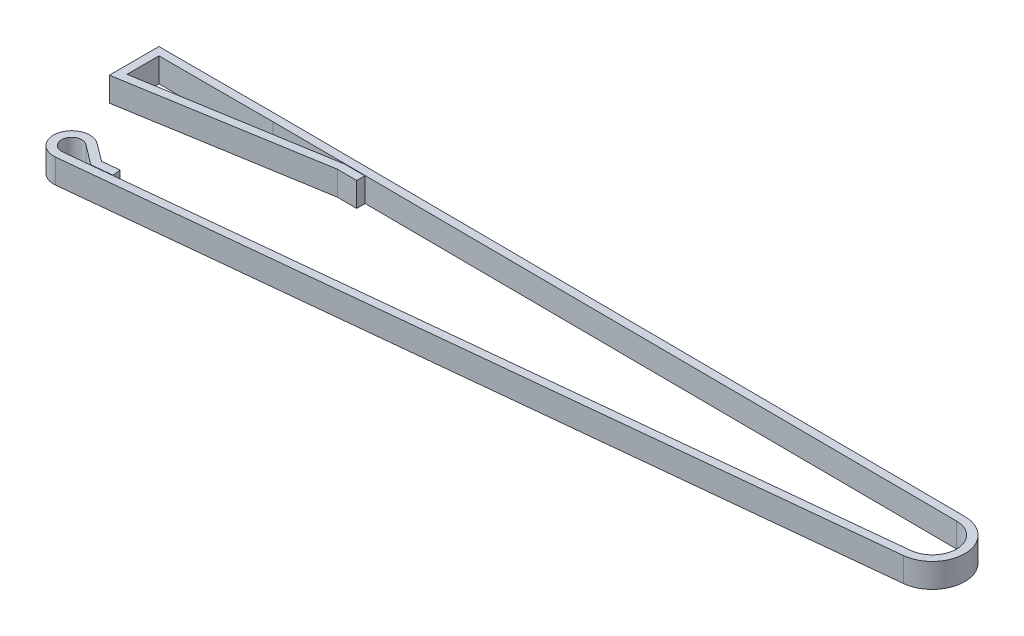
ISO-10303-21;
HEADER;
FILE_DESCRIPTION(('STEP AP214'),'2;1');
FILE_NAME('part.step','',(''),(''),'','','');
FILE_SCHEMA(('AUTOMOTIVE_DESIGN { 1 0 10303 214 1 1 1 1 }'));
ENDSEC;
DATA;
#1=APPLICATION_CONTEXT('core data for automotive mechanical design processes');
#2=APPLICATION_PROTOCOL_DEFINITION('international standard','automotive_design',2000,#1);
#3=PRODUCT_CONTEXT('',#1,'mechanical');
#4=PRODUCT('Part','Part','',(#3));
#5=PRODUCT_RELATED_PRODUCT_CATEGORY('part','',(#4));
#6=PRODUCT_DEFINITION_FORMATION('','',#4);
#7=PRODUCT_DEFINITION_CONTEXT('part definition',#1,'design');
#8=PRODUCT_DEFINITION('design','',#6,#7);
#9=PRODUCT_DEFINITION_SHAPE('','',#8);
#10=(LENGTH_UNIT() NAMED_UNIT(*) SI_UNIT(.MILLI.,.METRE.));
#11=(NAMED_UNIT(*) PLANE_ANGLE_UNIT() SI_UNIT($,.RADIAN.));
#12=(NAMED_UNIT(*) SI_UNIT($,.STERADIAN.) SOLID_ANGLE_UNIT());
#13=UNCERTAINTY_MEASURE_WITH_UNIT(LENGTH_MEASURE(1.E-05),#10,'distance_accuracy_value','');
#14=(GEOMETRIC_REPRESENTATION_CONTEXT(3) GLOBAL_UNCERTAINTY_ASSIGNED_CONTEXT((#13)) GLOBAL_UNIT_ASSIGNED_CONTEXT((#10,
#11,#12)) REPRESENTATION_CONTEXT('',''));
#15=CARTESIAN_POINT('',(0.,0.,0.));
#16=DIRECTION('',(0.,0.,1.));
#17=DIRECTION('',(1.,0.,0.));
#18=AXIS2_PLACEMENT_3D('',#15,#16,#17);
#19=CARTESIAN_POINT('',(-58.2701733579478,52.4000000000005,20.205566553322));
#20=DIRECTION('',(0.00587750390374397,0.,-0.999982727324758));
#21=DIRECTION('',(-0.999982727324758,0.,-0.00587750390374397));
#22=AXIS2_PLACEMENT_3D('',#19,#20,#21);
#23=PLANE('',#22);
#24=DIRECTION('',(0.999982727324758,0.,0.00587750390374397));
#25=VECTOR('',#24,1.);
#26=CARTESIAN_POINT('',(-58.2701733579478,46.4000000000005,20.205566553322));
#27=LINE('',#26,#25);
#28=CARTESIAN_POINT('',(-58.0987320051919,46.4000000000005,20.2065742179472));
#29=VERTEX_POINT('',#28);
#30=CARTESIAN_POINT('',(-53.2701733579478,46.4000000000005,20.2349545804506));
#31=VERTEX_POINT('',#30);
#32=EDGE_CURVE('E215',#29,#31,#27,.T.);
#33=ORIENTED_EDGE('',*,*,#32,.T.);
#34=DIRECTION('',(0.,-1.,0.));
#35=VECTOR('',#34,1.);
#36=CARTESIAN_POINT('',(-53.2701733579478,52.4000000000005,20.2349545804506));
#37=LINE('',#36,#35);
#38=CARTESIAN_POINT('',(-53.2701733579478,52.4000000000005,20.2349545804506));
#39=VERTEX_POINT('',#38);
#40=EDGE_CURVE('E11',#39,#31,#37,.T.);
#41=ORIENTED_EDGE('',*,*,#40,.F.);
#42=DIRECTION('',(0.999982727324758,0.,0.00587750390374397));
#43=VECTOR('',#42,1.);
#44=CARTESIAN_POINT('',(-58.2701733579478,52.4000000000005,20.205566553322));
#45=LINE('',#44,#43);
#46=CARTESIAN_POINT('',(-58.0987320051919,52.4000000000005,20.2065742179472));
#47=VERTEX_POINT('',#46);
#48=EDGE_CURVE('E134',#47,#39,#45,.T.);
#49=ORIENTED_EDGE('',*,*,#48,.F.);
#50=DIRECTION('',(0.,-1.,0.));
#51=VECTOR('',#50,1.);
#52=CARTESIAN_POINT('',(-58.0987320051919,52.4000000000005,20.2065742179472));
#53=LINE('',#52,#51);
#54=EDGE_CURVE('E211',#47,#29,#53,.T.);
#55=ORIENTED_EDGE('',*,*,#54,.T.);
#56=EDGE_LOOP('',(#33,#41,#49,#55));
#57=FACE_BOUND('',#56,.T.);
#58=ADVANCED_FACE('F36',(#57),#23,.F.);
#59=CARTESIAN_POINT('',(-53.2584183501403,52.4000000000005,18.2349891258011));
#60=DIRECTION('',(0.999982727324758,0.,0.005877503903743));
#61=DIRECTION('',(0.00587750390374301,0.,-0.999982727324758));
#62=AXIS2_PLACEMENT_3D('',#59,#60,#61);
#63=PLANE('',#62);
#64=DIRECTION('',(-0.00587750390374301,0.,0.999982727324758));
#65=VECTOR('',#64,1.);
#66=CARTESIAN_POINT('',(-53.2584183501403,46.4000000000005,18.2349891258011));
#67=LINE('',#66,#65);
#68=CARTESIAN_POINT('',(-53.2584183501403,46.4000000000005,18.2349891258011));
#69=VERTEX_POINT('',#68);
#70=EDGE_CURVE('E218',#69,#31,#67,.T.);
#71=ORIENTED_EDGE('',*,*,#70,.F.);
#72=DIRECTION('',(0.,-1.,0.));
#73=VECTOR('',#72,1.);
#74=CARTESIAN_POINT('',(-53.2584183501403,52.4000000000005,18.2349891258011));
#75=LINE('',#74,#73);
#76=CARTESIAN_POINT('',(-53.2584183501403,52.4000000000005,18.2349891258011));
#77=VERTEX_POINT('',#76);
#78=EDGE_CURVE('E44',#77,#69,#75,.T.);
#79=ORIENTED_EDGE('',*,*,#78,.F.);
#80=DIRECTION('',(-0.00587750390374301,0.,0.999982727324758));
#81=VECTOR('',#80,1.);
#82=CARTESIAN_POINT('',(-53.2584183501403,52.4000000000005,18.2349891258011));
#83=LINE('',#82,#81);
#84=EDGE_CURVE('E330',#77,#39,#83,.T.);
#85=ORIENTED_EDGE('',*,*,#84,.T.);
#86=ORIENTED_EDGE('',*,*,#40,.T.);
#87=EDGE_LOOP('',(#71,#79,#85,#86));
#88=FACE_BOUND('',#87,.T.);
#89=ADVANCED_FACE('F317',(#88),#63,.T.);
#90=CARTESIAN_POINT('',(-58.2584183501403,52.4000000000005,18.2056010986725));
#91=DIRECTION('',(0.00587750390374397,0.,-0.999982727324758));
#92=DIRECTION('',(-0.999982727324758,0.,-0.00587750390374397));
#93=AXIS2_PLACEMENT_3D('',#90,#91,#92);
#94=PLANE('',#93);
#95=DIRECTION('',(0.999982727324758,0.,0.00587750390374397));
#96=VECTOR('',#95,1.);
#97=CARTESIAN_POINT('',(-58.2584183501403,46.4000000000005,18.2056010986725));
#98=LINE('',#97,#96);
#99=CARTESIAN_POINT('',(-58.2584183501403,46.4000000000005,18.2056010986725));
#100=VERTEX_POINT('',#99);
#101=EDGE_CURVE('E221',#100,#69,#98,.T.);
#102=ORIENTED_EDGE('',*,*,#101,.F.);
#103=DIRECTION('',(0.,-1.,0.));
#104=VECTOR('',#103,1.);
#105=CARTESIAN_POINT('',(-58.2584183501403,52.4000000000005,18.2056010986725));
#106=LINE('',#105,#104);
#107=CARTESIAN_POINT('',(-58.2584183501403,52.4000000000005,18.2056010986725));
#108=VERTEX_POINT('',#107);
#109=EDGE_CURVE('E307',#108,#100,#106,.T.);
#110=ORIENTED_EDGE('',*,*,#109,.F.);
#111=DIRECTION('',(0.999982727324758,0.,0.00587750390374397));
#112=VECTOR('',#111,1.);
#113=CARTESIAN_POINT('',(-58.2584183501403,52.4000000000005,18.2056010986725));
#114=LINE('',#113,#112);
#115=EDGE_CURVE('E314',#108,#77,#114,.T.);
#116=ORIENTED_EDGE('',*,*,#115,.T.);
#117=ORIENTED_EDGE('',*,*,#78,.T.);
#118=EDGE_LOOP('',(#102,#110,#116,#117));
#119=FACE_BOUND('',#118,.T.);
#120=ADVANCED_FACE('F312',(#119),#94,.T.);
#121=CARTESIAN_POINT('',(-104.424811758105,52.4000000000005,25.9));
#122=DIRECTION('',(-0.164398987305357,0.,-0.986393923832144));
#123=DIRECTION('',(-0.986393923832144,0.,0.164398987305357));
#124=AXIS2_PLACEMENT_3D('',#121,#122,#123);
#125=PLANE('',#124);
#126=DIRECTION('',(0.986393923832144,0.,-0.164398987305357));
#127=VECTOR('',#126,1.);
#128=CARTESIAN_POINT('',(-104.424811758105,46.4000000000005,25.9));
#129=LINE('',#128,#127);
#130=CARTESIAN_POINT('',(-104.424811758105,46.4000000000005,25.9));
#131=VERTEX_POINT('',#130);
#132=EDGE_CURVE('E224',#131,#100,#129,.T.);
#133=ORIENTED_EDGE('',*,*,#132,.F.);
#134=DIRECTION('',(0.,-1.,0.));
#135=VECTOR('',#134,1.);
#136=CARTESIAN_POINT('',(-104.424811758105,52.4000000000005,25.9));
#137=LINE('',#136,#135);
#138=CARTESIAN_POINT('',(-104.424811758105,52.4000000000005,25.9));
#139=VERTEX_POINT('',#138);
#140=EDGE_CURVE('E305',#139,#131,#137,.T.);
#141=ORIENTED_EDGE('',*,*,#140,.F.);
#142=DIRECTION('',(0.986393923832144,0.,-0.164398987305357));
#143=VECTOR('',#142,1.);
#144=CARTESIAN_POINT('',(-104.424811758105,52.4000000000005,25.9));
#145=LINE('',#144,#143);
#146=EDGE_CURVE('E327',#139,#108,#145,.T.);
#147=ORIENTED_EDGE('',*,*,#146,.T.);
#148=ORIENTED_EDGE('',*,*,#109,.T.);
#149=EDGE_LOOP('',(#133,#141,#147,#148));
#150=FACE_BOUND('',#149,.T.);
#151=ADVANCED_FACE('F324',(#150),#125,.T.);
#152=CARTESIAN_POINT('',(-104.424811758105,52.4000000000005,18.));
#153=DIRECTION('',(1.,0.,0.));
#154=DIRECTION('',(0.,1.,0.));
#155=AXIS2_PLACEMENT_3D('',#152,#153,#154);
#156=PLANE('',#155);
#157=DIRECTION('',(0.,0.,1.));
#158=VECTOR('',#157,1.);
#159=CARTESIAN_POINT('',(-104.424811758105,46.4000000000005,18.));
#160=LINE('',#159,#158);
#161=CARTESIAN_POINT('',(-104.424811758105,46.4000000000005,18.));
#162=VERTEX_POINT('',#161);
#163=EDGE_CURVE('E227',#162,#131,#160,.T.);
#164=ORIENTED_EDGE('',*,*,#163,.F.);
#165=DIRECTION('',(0.,-1.,0.));
#166=VECTOR('',#165,1.);
#167=CARTESIAN_POINT('',(-104.424811758105,52.4000000000005,18.));
#168=LINE('',#167,#166);
#169=CARTESIAN_POINT('',(-104.424811758105,52.4000000000005,18.));
#170=VERTEX_POINT('',#169);
#171=EDGE_CURVE('E303',#170,#162,#168,.T.);
#172=ORIENTED_EDGE('',*,*,#171,.F.);
#173=DIRECTION('',(0.,0.,1.));
#174=VECTOR('',#173,1.);
#175=CARTESIAN_POINT('',(-104.424811758105,52.4000000000005,18.));
#176=LINE('',#175,#174);
#177=EDGE_CURVE('E332',#170,#139,#176,.T.);
#178=ORIENTED_EDGE('',*,*,#177,.T.);
#179=ORIENTED_EDGE('',*,*,#140,.T.);
#180=EDGE_LOOP('',(#164,#172,#178,#179));
#181=FACE_BOUND('',#180,.T.);
#182=ADVANCED_FACE('F403',(#181),#156,.T.);
#183=CARTESIAN_POINT('',(-76.2248117581054,52.4000000000005,18.));
#184=DIRECTION('',(0.,0.,1.));
#185=DIRECTION('',(1.,0.,0.));
#186=AXIS2_PLACEMENT_3D('',#183,#184,#185);
#187=PLANE('',#186);
#188=DIRECTION('',(-1.,0.,0.));
#189=VECTOR('',#188,1.);
#190=CARTESIAN_POINT('',(-76.2248117581054,46.4000000000005,18.));
#191=LINE('',#190,#189);
#192=CARTESIAN_POINT('',(-76.2248117581054,46.4000000000005,18.));
#193=VERTEX_POINT('',#192);
#194=EDGE_CURVE('E230',#193,#162,#191,.T.);
#195=ORIENTED_EDGE('',*,*,#194,.F.);
#196=DIRECTION('',(0.,-1.,0.));
#197=VECTOR('',#196,1.);
#198=CARTESIAN_POINT('',(-76.2248117581054,52.4000000000005,18.));
#199=LINE('',#198,#197);
#200=CARTESIAN_POINT('',(-76.2248117581054,52.4000000000005,18.));
#201=VERTEX_POINT('',#200);
#202=EDGE_CURVE('E301',#201,#193,#199,.T.);
#203=ORIENTED_EDGE('',*,*,#202,.F.);
#204=DIRECTION('',(-1.,0.,0.));
#205=VECTOR('',#204,1.);
#206=CARTESIAN_POINT('',(-76.2248117581054,52.4000000000005,18.));
#207=LINE('',#206,#205);
#208=EDGE_CURVE('E338',#201,#170,#207,.T.);
#209=ORIENTED_EDGE('',*,*,#208,.T.);
#210=ORIENTED_EDGE('',*,*,#171,.T.);
#211=EDGE_LOOP('',(#195,#203,#209,#210));
#212=FACE_BOUND('',#211,.T.);
#213=ADVANCED_FACE('F406',(#212),#187,.T.);
#214=CARTESIAN_POINT('',(93.9301346212878,52.4000000000005,19.0001036360515));
#215=DIRECTION('',(-0.00587750390374344,0.,0.999982727324758));
#216=DIRECTION('',(0.999982727324758,0.,0.00587750390374344));
#217=AXIS2_PLACEMENT_3D('',#214,#215,#216);
#218=PLANE('',#217);
#219=DIRECTION('',(-0.999982727324758,0.,-0.00587750390374344));
#220=VECTOR('',#219,1.);
#221=CARTESIAN_POINT('',(93.9301346212878,46.4000000000005,19.0001036360515));
#222=LINE('',#221,#220);
#223=CARTESIAN_POINT('',(93.9301346212878,46.4000000000005,19.0001036360514));
#224=VERTEX_POINT('',#223);
#225=EDGE_CURVE('E233',#224,#193,#222,.T.);
#226=ORIENTED_EDGE('',*,*,#225,.F.);
#227=DIRECTION('',(0.,-1.,0.));
#228=VECTOR('',#227,1.);
#229=CARTESIAN_POINT('',(93.9301346212878,52.4000000000005,19.0001036360514));
#230=LINE('',#229,#228);
#231=CARTESIAN_POINT('',(93.9301346212878,52.4000000000005,19.0001036360514));
#232=VERTEX_POINT('',#231);
#233=EDGE_CURVE('E299',#232,#224,#230,.T.);
#234=ORIENTED_EDGE('',*,*,#233,.F.);
#235=DIRECTION('',(-0.999982727324758,0.,-0.00587750390374344));
#236=VECTOR('',#235,1.);
#237=CARTESIAN_POINT('',(93.9301346212878,52.4000000000005,19.0001036360515));
#238=LINE('',#237,#236);
#239=EDGE_CURVE('E341',#232,#201,#238,.T.);
#240=ORIENTED_EDGE('',*,*,#239,.T.);
#241=ORIENTED_EDGE('',*,*,#202,.T.);
#242=EDGE_LOOP('',(#226,#234,#240,#241));
#243=FACE_BOUND('',#242,.T.);
#244=ADVANCED_FACE('F410',(#243),#218,.T.);
#245=CARTESIAN_POINT('',(93.8948695978654,52.4000000000005,25.));
#246=DIRECTION('',(0.,-1.,0.));
#247=DIRECTION('',(1.,0.,0.));
#248=AXIS2_PLACEMENT_3D('',#245,#246,#247);
#249=CYLINDRICAL_SURFACE('',#248,6.);
#250=CARTESIAN_POINT('',(93.8948695978654,46.4000000000005,25.));
#251=DIRECTION('',(0.,1.,0.));
#252=DIRECTION('',(1.,0.,0.));
#253=AXIS2_PLACEMENT_3D('',#250,#251,#252);
#254=CIRCLE('',#253,6.);
#255=CARTESIAN_POINT('',(94.5072055435056,46.4000000000005,30.9686719368447));
#256=VERTEX_POINT('',#255);
#257=EDGE_CURVE('E236',#256,#224,#254,.T.);
#258=ORIENTED_EDGE('',*,*,#257,.F.);
#259=DIRECTION('',(0.,-1.,0.));
#260=VECTOR('',#259,1.);
#261=CARTESIAN_POINT('',(94.5072055435056,52.4000000000005,30.9686719368447));
#262=LINE('',#261,#260);
#263=CARTESIAN_POINT('',(94.5072055435056,52.4000000000005,30.9686719368447));
#264=VERTEX_POINT('',#263);
#265=EDGE_CURVE('E297',#264,#256,#262,.T.);
#266=ORIENTED_EDGE('',*,*,#265,.F.);
#267=CARTESIAN_POINT('',(93.8948695978654,52.4000000000005,25.));
#268=DIRECTION('',(0.,1.,0.));
#269=DIRECTION('',(1.,0.,0.));
#270=AXIS2_PLACEMENT_3D('',#267,#268,#269);
#271=CIRCLE('',#270,6.);
#272=EDGE_CURVE('E344',#264,#232,#271,.T.);
#273=ORIENTED_EDGE('',*,*,#272,.T.);
#274=ORIENTED_EDGE('',*,*,#233,.T.);
#275=EDGE_LOOP('',(#258,#266,#273,#274));
#276=FACE_BOUND('',#275,.T.);
#277=ADVANCED_FACE('F414',(#276),#249,.F.);
#278=CARTESIAN_POINT('',(-95.7448600226497,52.4000000000005,50.4869466403535));
#279=DIRECTION('',(-0.102055990940038,0.,-0.994778656140775));
#280=DIRECTION('',(-0.994778656140775,0.,0.102055990940038));
#281=AXIS2_PLACEMENT_3D('',#278,#279,#280);
#282=PLANE('',#281);
#283=DIRECTION('',(0.994778656140775,0.,-0.102055990940038));
#284=VECTOR('',#283,1.);
#285=CARTESIAN_POINT('',(-95.7448600226497,46.4000000000005,50.4869466403535));
#286=LINE('',#285,#284);
#287=CARTESIAN_POINT('',(-95.7448600226497,46.4000000000005,50.4869466403541));
#288=VERTEX_POINT('',#287);
#289=EDGE_CURVE('E239',#288,#256,#286,.T.);
#290=ORIENTED_EDGE('',*,*,#289,.F.);
#291=DIRECTION('',(0.,-1.,0.));
#292=VECTOR('',#291,1.);
#293=CARTESIAN_POINT('',(-95.7448600226497,52.4000000000005,50.4869466403541));
#294=LINE('',#293,#292);
#295=CARTESIAN_POINT('',(-95.7448600226497,52.4000000000005,50.4869466403541));
#296=VERTEX_POINT('',#295);
#297=EDGE_CURVE('E295',#296,#288,#294,.T.);
#298=ORIENTED_EDGE('',*,*,#297,.F.);
#299=DIRECTION('',(0.994778656140775,0.,-0.102055990940038));
#300=VECTOR('',#299,1.);
#301=CARTESIAN_POINT('',(-95.7448600226497,52.4000000000005,50.4869466403535));
#302=LINE('',#301,#300);
#303=EDGE_CURVE('E347',#296,#264,#302,.T.);
#304=ORIENTED_EDGE('',*,*,#303,.T.);
#305=ORIENTED_EDGE('',*,*,#265,.T.);
#306=EDGE_LOOP('',(#290,#298,#304,#305));
#307=FACE_BOUND('',#306,.T.);
#308=ADVANCED_FACE('F418',(#307),#282,.T.);
#309=CARTESIAN_POINT('',(-95.9999999999998,52.4000000000005,48.0000000000005));
#310=DIRECTION('',(0.,-1.,0.));
#311=DIRECTION('',(1.,0.,0.));
#312=AXIS2_PLACEMENT_3D('',#309,#310,#311);
#313=CYLINDRICAL_SURFACE('',#312,2.50000000000166);
#314=CARTESIAN_POINT('',(-95.9999999999998,46.4000000000005,48.0000000000005));
#315=DIRECTION('',(0.,1.,0.));
#316=DIRECTION('',(1.,0.,0.));
#317=AXIS2_PLACEMENT_3D('',#314,#315,#316);
#318=CIRCLE('',#317,2.50000000000166);
#319=CARTESIAN_POINT('',(-94.4955453211408,46.4000000000005,46.0033487737544));
#320=VERTEX_POINT('',#319);
#321=EDGE_CURVE('E242',#320,#288,#318,.T.);
#322=ORIENTED_EDGE('',*,*,#321,.F.);
#323=DIRECTION('',(0.,-1.,0.));
#324=VECTOR('',#323,1.);
#325=CARTESIAN_POINT('',(-94.4955453211408,52.4000000000005,46.0033487737544));
#326=LINE('',#325,#324);
#327=CARTESIAN_POINT('',(-94.4955453211408,52.4000000000005,46.0033487737544));
#328=VERTEX_POINT('',#327);
#329=EDGE_CURVE('E293',#328,#320,#326,.T.);
#330=ORIENTED_EDGE('',*,*,#329,.F.);
#331=CARTESIAN_POINT('',(-95.9999999999998,52.4000000000005,48.0000000000005));
#332=DIRECTION('',(0.,1.,0.));
#333=DIRECTION('',(1.,0.,0.));
#334=AXIS2_PLACEMENT_3D('',#331,#332,#333);
#335=CIRCLE('',#334,2.50000000000166);
#336=EDGE_CURVE('E350',#328,#296,#335,.T.);
#337=ORIENTED_EDGE('',*,*,#336,.T.);
#338=ORIENTED_EDGE('',*,*,#297,.T.);
#339=EDGE_LOOP('',(#322,#330,#337,#338));
#340=FACE_BOUND('',#339,.T.);
#341=ADVANCED_FACE('F422',(#340),#313,.F.);
#342=CARTESIAN_POINT('',(-94.4955453211408,52.4000000000005,46.0033487737544));
#343=DIRECTION('',(-0.601781871543245,0.,0.798660490497627));
#344=DIRECTION('',(0.798660490497627,0.,0.601781871543245));
#345=AXIS2_PLACEMENT_3D('',#342,#343,#344);
#346=PLANE('',#345);
#347=DIRECTION('',(-0.798660490497627,0.,-0.601781871543245));
#348=VECTOR('',#347,1.);
#349=CARTESIAN_POINT('',(-94.4955453211408,46.4000000000005,46.0033487737544));
#350=LINE('',#349,#348);
#351=CARTESIAN_POINT('',(-89.525331554851,46.4000000000005,49.7483500325299));
#352=VERTEX_POINT('',#351);
#353=EDGE_CURVE('E245',#352,#320,#350,.T.);
#354=ORIENTED_EDGE('',*,*,#353,.F.);
#355=DIRECTION('',(0.,-1.,0.));
#356=VECTOR('',#355,1.);
#357=CARTESIAN_POINT('',(-89.525331554851,52.4000000000005,49.7483500325299));
#358=LINE('',#357,#356);
#359=CARTESIAN_POINT('',(-89.525331554851,52.4000000000005,49.7483500325299));
#360=VERTEX_POINT('',#359);
#361=EDGE_CURVE('E291',#360,#352,#358,.T.);
#362=ORIENTED_EDGE('',*,*,#361,.F.);
#363=DIRECTION('',(-0.798660490497627,0.,-0.601781871543245));
#364=VECTOR('',#363,1.);
#365=CARTESIAN_POINT('',(-94.4955453211408,52.4000000000005,46.0033487737544));
#366=LINE('',#365,#364);
#367=EDGE_CURVE('E353',#360,#328,#366,.T.);
#368=ORIENTED_EDGE('',*,*,#367,.T.);
#369=ORIENTED_EDGE('',*,*,#329,.T.);
#370=EDGE_LOOP('',(#354,#362,#368,#369));
#371=FACE_BOUND('',#370,.T.);
#372=ADVANCED_FACE('F426',(#371),#346,.T.);
#373=CARTESIAN_POINT('',(-89.525331554851,52.4000000000005,49.7483500325299));
#374=DIRECTION('',(0.102055990940038,0.,0.994778656140775));
#375=DIRECTION('',(0.994778656140775,0.,-0.102055990940038));
#376=AXIS2_PLACEMENT_3D('',#373,#374,#375);
#377=PLANE('',#376);
#378=DIRECTION('',(-0.994778656140775,0.,0.102055990940038));
#379=VECTOR('',#378,1.);
#380=CARTESIAN_POINT('',(-89.525331554851,46.4000000000005,49.7483500325299));
#381=LINE('',#380,#379);
#382=CARTESIAN_POINT('',(-84.5514382741471,46.4000000000005,49.2380700778297));
#383=VERTEX_POINT('',#382);
#384=EDGE_CURVE('E248',#383,#352,#381,.T.);
#385=ORIENTED_EDGE('',*,*,#384,.F.);
#386=DIRECTION('',(0.,-1.,0.));
#387=VECTOR('',#386,1.);
#388=CARTESIAN_POINT('',(-84.5514382741471,52.4000000000005,49.2380700778297));
#389=LINE('',#388,#387);
#390=CARTESIAN_POINT('',(-84.5514382741471,52.4000000000005,49.2380700778297));
#391=VERTEX_POINT('',#390);
#392=EDGE_CURVE('E289',#391,#383,#389,.T.);
#393=ORIENTED_EDGE('',*,*,#392,.F.);
#394=DIRECTION('',(-0.994778656140775,0.,0.102055990940038));
#395=VECTOR('',#394,1.);
#396=CARTESIAN_POINT('',(-89.525331554851,52.4000000000005,49.7483500325299));
#397=LINE('',#396,#395);
#398=EDGE_CURVE('E356',#391,#360,#397,.T.);
#399=ORIENTED_EDGE('',*,*,#398,.T.);
#400=ORIENTED_EDGE('',*,*,#361,.T.);
#401=EDGE_LOOP('',(#385,#393,#399,#400));
#402=FACE_BOUND('',#401,.T.);
#403=ADVANCED_FACE('F430',(#402),#377,.T.);
#404=CARTESIAN_POINT('',(-84.7555502560272,52.4000000000005,47.2485127655481));
#405=DIRECTION('',(0.994778656140776,0.,-0.102055990940035));
#406=DIRECTION('',(-0.102055990940035,0.,-0.994778656140776));
#407=AXIS2_PLACEMENT_3D('',#404,#405,#406);
#408=PLANE('',#407);
#409=DIRECTION('',(0.102055990940035,0.,0.994778656140776));
#410=VECTOR('',#409,1.);
#411=CARTESIAN_POINT('',(-84.7555502560272,46.4000000000005,47.2485127655481));
#412=LINE('',#411,#410);
#413=CARTESIAN_POINT('',(-84.7555502560272,46.4000000000005,47.2485127655481));
#414=VERTEX_POINT('',#413);
#415=EDGE_CURVE('E251',#414,#383,#412,.T.);
#416=ORIENTED_EDGE('',*,*,#415,.F.);
#417=DIRECTION('',(0.,-1.,0.));
#418=VECTOR('',#417,1.);
#419=CARTESIAN_POINT('',(-84.7555502560272,52.4000000000005,47.2485127655481));
#420=LINE('',#419,#418);
#421=CARTESIAN_POINT('',(-84.7555502560272,52.4000000000005,47.2485127655481));
#422=VERTEX_POINT('',#421);
#423=EDGE_CURVE('E287',#422,#414,#420,.T.);
#424=ORIENTED_EDGE('',*,*,#423,.F.);
#425=DIRECTION('',(0.102055990940035,0.,0.994778656140776));
#426=VECTOR('',#425,1.);
#427=CARTESIAN_POINT('',(-84.7555502560272,52.4000000000005,47.2485127655481));
#428=LINE('',#427,#426);
#429=EDGE_CURVE('E359',#422,#391,#428,.T.);
#430=ORIENTED_EDGE('',*,*,#429,.T.);
#431=ORIENTED_EDGE('',*,*,#392,.T.);
#432=EDGE_LOOP('',(#416,#424,#430,#431));
#433=FACE_BOUND('',#432,.T.);
#434=ADVANCED_FACE('F434',(#433),#408,.T.);
#435=CARTESIAN_POINT('',(-89.7294435367311,52.4000000000005,47.7587927202483));
#436=DIRECTION('',(0.102055990940038,0.,0.994778656140775));
#437=DIRECTION('',(0.994778656140775,0.,-0.102055990940038));
#438=AXIS2_PLACEMENT_3D('',#435,#436,#437);
#439=PLANE('',#438);
#440=DIRECTION('',(-0.994778656140775,0.,0.102055990940038));
#441=VECTOR('',#440,1.);
#442=CARTESIAN_POINT('',(-89.7294435367311,46.4000000000005,47.7587927202483));
#443=LINE('',#442,#441);
#444=CARTESIAN_POINT('',(-88.9486388082355,46.4000000000005,47.6786886691558));
#445=VERTEX_POINT('',#444);
#446=EDGE_CURVE('E254',#414,#445,#443,.T.);
#447=ORIENTED_EDGE('',*,*,#446,.T.);
#448=DIRECTION('',(0.,-1.,0.));
#449=VECTOR('',#448,1.);
#450=CARTESIAN_POINT('',(-88.9486388082355,52.4000000000005,47.6786886691558));
#451=LINE('',#450,#449);
#452=CARTESIAN_POINT('',(-88.9486388082355,52.4000000000005,47.6786886691558));
#453=VERTEX_POINT('',#452);
#454=EDGE_CURVE('E284',#453,#445,#451,.T.);
#455=ORIENTED_EDGE('',*,*,#454,.F.);
#456=DIRECTION('',(-0.994778656140775,0.,0.102055990940038));
#457=VECTOR('',#456,1.);
#458=CARTESIAN_POINT('',(-89.7294435367311,52.4000000000005,47.7587927202483));
#459=LINE('',#458,#457);
#460=EDGE_CURVE('E362',#422,#453,#459,.T.);
#461=ORIENTED_EDGE('',*,*,#460,.F.);
#462=ORIENTED_EDGE('',*,*,#423,.T.);
#463=EDGE_LOOP('',(#447,#455,#461,#462));
#464=FACE_BOUND('',#463,.T.);
#465=ADVANCED_FACE('F438',(#464),#439,.F.);
#466=CARTESIAN_POINT('',(-93.2919815780543,52.4000000000005,44.4060277927591));
#467=DIRECTION('',(-0.601781871543245,0.,0.798660490497627));
#468=DIRECTION('',(0.798660490497627,0.,0.601781871543245));
#469=AXIS2_PLACEMENT_3D('',#466,#467,#468);
#470=PLANE('',#469);
#471=DIRECTION('',(-0.798660490497627,0.,-0.601781871543245));
#472=VECTOR('',#471,1.);
#473=CARTESIAN_POINT('',(-93.2919815780543,46.4000000000005,44.4060277927591));
#474=LINE('',#473,#472);
#475=CARTESIAN_POINT('',(-93.2919815780549,46.4000000000005,44.4060277927593));
#476=VERTEX_POINT('',#475);
#477=EDGE_CURVE('E256',#445,#476,#474,.T.);
#478=ORIENTED_EDGE('',*,*,#477,.T.);
#479=DIRECTION('',(0.,-1.,0.));
#480=VECTOR('',#479,1.);
#481=CARTESIAN_POINT('',(-93.2919815780549,52.4000000000005,44.4060277927593));
#482=LINE('',#481,#480);
#483=CARTESIAN_POINT('',(-93.2919815780549,52.4000000000005,44.4060277927593));
#484=VERTEX_POINT('',#483);
#485=EDGE_CURVE('E281',#484,#476,#482,.T.);
#486=ORIENTED_EDGE('',*,*,#485,.F.);
#487=DIRECTION('',(-0.798660490497627,0.,-0.601781871543245));
#488=VECTOR('',#487,1.);
#489=CARTESIAN_POINT('',(-93.2919815780543,52.4000000000005,44.4060277927591));
#490=LINE('',#489,#488);
#491=EDGE_CURVE('E364',#453,#484,#490,.T.);
#492=ORIENTED_EDGE('',*,*,#491,.F.);
#493=ORIENTED_EDGE('',*,*,#454,.T.);
#494=EDGE_LOOP('',(#478,#486,#492,#493));
#495=FACE_BOUND('',#494,.T.);
#496=ADVANCED_FACE('F442',(#495),#470,.F.);
#497=CARTESIAN_POINT('',(-95.9999999999998,52.4000000000005,48.0000000000005));
#498=DIRECTION('',(0.,-1.,0.));
#499=DIRECTION('',(1.,0.,0.));
#500=AXIS2_PLACEMENT_3D('',#497,#498,#499);
#501=CYLINDRICAL_SURFACE('',#500,4.50000000000166);
#502=CARTESIAN_POINT('',(-95.9999999999998,46.4000000000005,48.0000000000005));
#503=DIRECTION('',(0.,1.,0.));
#504=DIRECTION('',(1.,0.,0.));
#505=AXIS2_PLACEMENT_3D('',#502,#503,#504);
#506=CIRCLE('',#505,4.50000000000166);
#507=CARTESIAN_POINT('',(-95.5407480407697,46.4000000000005,52.4765039526351));
#508=VERTEX_POINT('',#507);
#509=EDGE_CURVE('E258',#476,#508,#506,.T.);
#510=ORIENTED_EDGE('',*,*,#509,.T.);
#511=DIRECTION('',(0.,-1.,0.));
#512=VECTOR('',#511,1.);
#513=CARTESIAN_POINT('',(-95.5407480407697,52.4000000000005,52.4765039526351));
#514=LINE('',#513,#512);
#515=CARTESIAN_POINT('',(-95.5407480407697,52.4000000000005,52.4765039526351));
#516=VERTEX_POINT('',#515);
#517=EDGE_CURVE('E278',#516,#508,#514,.T.);
#518=ORIENTED_EDGE('',*,*,#517,.F.);
#519=CARTESIAN_POINT('',(-95.9999999999998,52.4000000000005,48.0000000000005));
#520=DIRECTION('',(0.,1.,0.));
#521=DIRECTION('',(1.,0.,0.));
#522=AXIS2_PLACEMENT_3D('',#519,#520,#521);
#523=CIRCLE('',#522,4.50000000000166);
#524=EDGE_CURVE('E366',#484,#516,#523,.T.);
#525=ORIENTED_EDGE('',*,*,#524,.F.);
#526=ORIENTED_EDGE('',*,*,#485,.T.);
#527=EDGE_LOOP('',(#510,#518,#525,#526));
#528=FACE_BOUND('',#527,.T.);
#529=ADVANCED_FACE('F446',(#528),#501,.T.);
#530=CARTESIAN_POINT('',(-95.5407480407697,52.4000000000005,52.4765039526351));
#531=DIRECTION('',(-0.102055990940038,0.,-0.994778656140775));
#532=DIRECTION('',(-0.994778656140775,0.,0.102055990940038));
#533=AXIS2_PLACEMENT_3D('',#530,#531,#532);
#534=PLANE('',#533);
#535=DIRECTION('',(0.994778656140775,0.,-0.102055990940038));
#536=VECTOR('',#535,1.);
#537=CARTESIAN_POINT('',(-95.5407480407697,46.4000000000005,52.4765039526351));
#538=LINE('',#537,#536);
#539=CARTESIAN_POINT('',(94.7113175253857,46.4000000000005,32.9582292491262));
#540=VERTEX_POINT('',#539);
#541=EDGE_CURVE('E260',#508,#540,#538,.T.);
#542=ORIENTED_EDGE('',*,*,#541,.T.);
#543=DIRECTION('',(0.,-1.,0.));
#544=VECTOR('',#543,1.);
#545=CARTESIAN_POINT('',(94.7113175253857,52.4000000000005,32.9582292491262));
#546=LINE('',#545,#544);
#547=CARTESIAN_POINT('',(94.7113175253857,52.4000000000005,32.9582292491262));
#548=VERTEX_POINT('',#547);
#549=EDGE_CURVE('E275',#548,#540,#546,.T.);
#550=ORIENTED_EDGE('',*,*,#549,.F.);
#551=DIRECTION('',(0.994778656140775,0.,-0.102055990940038));
#552=VECTOR('',#551,1.);
#553=CARTESIAN_POINT('',(-95.5407480407697,52.4000000000005,52.4765039526351));
#554=LINE('',#553,#552);
#555=EDGE_CURVE('E368',#516,#548,#554,.T.);
#556=ORIENTED_EDGE('',*,*,#555,.F.);
#557=ORIENTED_EDGE('',*,*,#517,.T.);
#558=EDGE_LOOP('',(#542,#550,#556,#557));
#559=FACE_BOUND('',#558,.T.);
#560=ADVANCED_FACE('F450',(#559),#534,.F.);
#561=CARTESIAN_POINT('',(93.8948695978654,52.4000000000005,25.));
#562=DIRECTION('',(0.,-1.,0.));
#563=DIRECTION('',(1.,0.,0.));
#564=AXIS2_PLACEMENT_3D('',#561,#562,#563);
#565=CYLINDRICAL_SURFACE('',#564,8.);
#566=CARTESIAN_POINT('',(93.8948695978654,46.4000000000005,25.));
#567=DIRECTION('',(0.,1.,0.));
#568=DIRECTION('',(1.,0.,0.));
#569=AXIS2_PLACEMENT_3D('',#566,#567,#568);
#570=CIRCLE('',#569,8.);
#571=CARTESIAN_POINT('',(93.9418896290953,46.4000000000005,17.0001381814019));
#572=VERTEX_POINT('',#571);
#573=EDGE_CURVE('E262',#540,#572,#570,.T.);
#574=ORIENTED_EDGE('',*,*,#573,.T.);
#575=DIRECTION('',(0.,-1.,0.));
#576=VECTOR('',#575,1.);
#577=CARTESIAN_POINT('',(93.9418896290953,52.4000000000005,17.0001381814019));
#578=LINE('',#577,#576);
#579=CARTESIAN_POINT('',(93.9418896290953,52.4000000000005,17.0001381814019));
#580=VERTEX_POINT('',#579);
#581=EDGE_CURVE('E272',#580,#572,#578,.T.);
#582=ORIENTED_EDGE('',*,*,#581,.F.);
#583=CARTESIAN_POINT('',(93.8948695978654,52.4000000000005,25.));
#584=DIRECTION('',(0.,1.,0.));
#585=DIRECTION('',(1.,0.,0.));
#586=AXIS2_PLACEMENT_3D('',#583,#584,#585);
#587=CIRCLE('',#586,8.);
#588=EDGE_CURVE('E370',#548,#580,#587,.T.);
#589=ORIENTED_EDGE('',*,*,#588,.F.);
#590=ORIENTED_EDGE('',*,*,#549,.T.);
#591=EDGE_LOOP('',(#574,#582,#589,#590));
#592=FACE_BOUND('',#591,.T.);
#593=ADVANCED_FACE('F376',(#592),#565,.T.);
#594=CARTESIAN_POINT('',(93.9418896290953,52.4000000000005,17.0001381814019));
#595=DIRECTION('',(-0.00587750390374344,0.,0.999982727324758));
#596=DIRECTION('',(0.999982727324758,0.,0.00587750390374344));
#597=AXIS2_PLACEMENT_3D('',#594,#595,#596);
#598=PLANE('',#597);
#599=DIRECTION('',(-0.999982727324758,0.,-0.00587750390374344));
#600=VECTOR('',#599,1.);
#601=CARTESIAN_POINT('',(93.9418896290953,46.4000000000005,17.0001381814019));
#602=LINE('',#601,#600);
#603=CARTESIAN_POINT('',(-76.2189342034409,46.4000000000005,16.));
#604=VERTEX_POINT('',#603);
#605=EDGE_CURVE('E264',#572,#604,#602,.T.);
#606=ORIENTED_EDGE('',*,*,#605,.T.);
#607=DIRECTION('',(0.,-1.,0.));
#608=VECTOR('',#607,1.);
#609=CARTESIAN_POINT('',(-76.2189342034409,52.4000000000005,16.));
#610=LINE('',#609,#608);
#611=CARTESIAN_POINT('',(-76.2189342034409,52.4000000000005,16.));
#612=VERTEX_POINT('',#611);
#613=EDGE_CURVE('E206',#612,#604,#610,.T.);
#614=ORIENTED_EDGE('',*,*,#613,.F.);
#615=DIRECTION('',(-0.999982727324758,0.,-0.00587750390374344));
#616=VECTOR('',#615,1.);
#617=CARTESIAN_POINT('',(93.9418896290953,52.4000000000005,17.0001381814019));
#618=LINE('',#617,#616);
#619=EDGE_CURVE('E197',#580,#612,#618,.T.);
#620=ORIENTED_EDGE('',*,*,#619,.F.);
#621=ORIENTED_EDGE('',*,*,#581,.T.);
#622=EDGE_LOOP('',(#606,#614,#620,#621));
#623=FACE_BOUND('',#622,.T.);
#624=ADVANCED_FACE('F380',(#623),#598,.F.);
#625=CARTESIAN_POINT('',(-76.2248117581054,52.4000000000005,16.));
#626=DIRECTION('',(0.,0.,1.));
#627=DIRECTION('',(1.,0.,0.));
#628=AXIS2_PLACEMENT_3D('',#625,#626,#627);
#629=PLANE('',#628);
#630=DIRECTION('',(-1.,0.,0.));
#631=VECTOR('',#630,1.);
#632=CARTESIAN_POINT('',(-76.2248117581054,46.4000000000005,16.));
#633=LINE('',#632,#631);
#634=CARTESIAN_POINT('',(-106.424811758105,46.4000000000005,16.));
#635=VERTEX_POINT('',#634);
#636=EDGE_CURVE('E205',#604,#635,#633,.T.);
#637=ORIENTED_EDGE('',*,*,#636,.T.);
#638=DIRECTION('',(0.,-1.,0.));
#639=VECTOR('',#638,1.);
#640=CARTESIAN_POINT('',(-106.424811758105,52.4000000000005,16.));
#641=LINE('',#640,#639);
#642=CARTESIAN_POINT('',(-106.424811758105,52.4000000000005,16.));
#643=VERTEX_POINT('',#642);
#644=EDGE_CURVE('E202',#643,#635,#641,.T.);
#645=ORIENTED_EDGE('',*,*,#644,.F.);
#646=DIRECTION('',(-1.,0.,0.));
#647=VECTOR('',#646,1.);
#648=CARTESIAN_POINT('',(-76.2248117581054,52.4000000000005,16.));
#649=LINE('',#648,#647);
#650=EDGE_CURVE('E191',#612,#643,#649,.T.);
#651=ORIENTED_EDGE('',*,*,#650,.F.);
#652=ORIENTED_EDGE('',*,*,#613,.T.);
#653=EDGE_LOOP('',(#637,#645,#651,#652));
#654=FACE_BOUND('',#653,.T.);
#655=ADVANCED_FACE('F203',(#654),#629,.F.);
#656=CARTESIAN_POINT('',(-106.424811758105,52.4000000000005,18.));
#657=DIRECTION('',(1.,0.,0.));
#658=DIRECTION('',(0.,1.,0.));
#659=AXIS2_PLACEMENT_3D('',#656,#657,#658);
#660=PLANE('',#659);
#661=DIRECTION('',(0.,0.,1.));
#662=VECTOR('',#661,1.);
#663=CARTESIAN_POINT('',(-106.424811758105,46.4000000000005,18.));
#664=LINE('',#663,#662);
#665=CARTESIAN_POINT('',(-106.424811758105,46.4000000000005,28.2609208434327));
#666=VERTEX_POINT('',#665);
#667=EDGE_CURVE('E122',#635,#666,#664,.T.);
#668=ORIENTED_EDGE('',*,*,#667,.T.);
#669=DIRECTION('',(0.,-1.,0.));
#670=VECTOR('',#669,1.);
#671=CARTESIAN_POINT('',(-106.424811758105,52.4000000000005,28.2609208434327));
#672=LINE('',#671,#670);
#673=CARTESIAN_POINT('',(-106.424811758105,52.4000000000005,28.2609208434327));
#674=VERTEX_POINT('',#673);
#675=EDGE_CURVE('E207',#674,#666,#672,.T.);
#676=ORIENTED_EDGE('',*,*,#675,.F.);
#677=DIRECTION('',(0.,0.,1.));
#678=VECTOR('',#677,1.);
#679=CARTESIAN_POINT('',(-106.424811758105,52.4000000000005,18.));
#680=LINE('',#679,#678);
#681=EDGE_CURVE('E195',#643,#674,#680,.T.);
#682=ORIENTED_EDGE('',*,*,#681,.F.);
#683=ORIENTED_EDGE('',*,*,#644,.T.);
#684=EDGE_LOOP('',(#668,#676,#682,#683));
#685=FACE_BOUND('',#684,.T.);
#686=ADVANCED_FACE('F209',(#685),#660,.F.);
#687=CARTESIAN_POINT('',(-104.096013783495,52.4000000000005,27.8727878476643));
#688=DIRECTION('',(-0.164398987305357,0.,-0.986393923832144));
#689=DIRECTION('',(-0.986393923832144,0.,0.164398987305357));
#690=AXIS2_PLACEMENT_3D('',#687,#688,#689);
#691=PLANE('',#690);
#692=DIRECTION('',(0.986393923832144,0.,-0.164398987305357));
#693=VECTOR('',#692,1.);
#694=CARTESIAN_POINT('',(-104.096013783495,46.4000000000005,27.8727878476643));
#695=LINE('',#694,#693);
#696=EDGE_CURVE('E128',#666,#29,#695,.T.);
#697=ORIENTED_EDGE('',*,*,#696,.T.);
#698=ORIENTED_EDGE('',*,*,#54,.F.);
#699=DIRECTION('',(0.986393923832144,0.,-0.164398987305357));
#700=VECTOR('',#699,1.);
#701=CARTESIAN_POINT('',(-104.096013783495,52.4000000000005,27.8727878476643));
#702=LINE('',#701,#700);
#703=EDGE_CURVE('E52',#674,#47,#702,.T.);
#704=ORIENTED_EDGE('',*,*,#703,.F.);
#705=ORIENTED_EDGE('',*,*,#675,.T.);
#706=EDGE_LOOP('',(#697,#698,#704,#705));
#707=FACE_BOUND('',#706,.T.);
#708=ADVANCED_FACE('F382',(#707),#691,.F.);
#709=CARTESIAN_POINT('',(93.8948695978654,52.4000000000005,25.));
#710=DIRECTION('',(0.,1.,0.));
#711=DIRECTION('',(1.,0.,0.));
#712=AXIS2_PLACEMENT_3D('',#709,#710,#711);
#713=PLANE('',#712);
#714=ORIENTED_EDGE('',*,*,#48,.T.);
#715=ORIENTED_EDGE('',*,*,#84,.F.);
#716=ORIENTED_EDGE('',*,*,#115,.F.);
#717=ORIENTED_EDGE('',*,*,#146,.F.);
#718=ORIENTED_EDGE('',*,*,#177,.F.);
#719=ORIENTED_EDGE('',*,*,#208,.F.);
#720=ORIENTED_EDGE('',*,*,#239,.F.);
#721=ORIENTED_EDGE('',*,*,#272,.F.);
#722=ORIENTED_EDGE('',*,*,#303,.F.);
#723=ORIENTED_EDGE('',*,*,#336,.F.);
#724=ORIENTED_EDGE('',*,*,#367,.F.);
#725=ORIENTED_EDGE('',*,*,#398,.F.);
#726=ORIENTED_EDGE('',*,*,#429,.F.);
#727=ORIENTED_EDGE('',*,*,#460,.T.);
#728=ORIENTED_EDGE('',*,*,#491,.T.);
#729=ORIENTED_EDGE('',*,*,#524,.T.);
#730=ORIENTED_EDGE('',*,*,#555,.T.);
#731=ORIENTED_EDGE('',*,*,#588,.T.);
#732=ORIENTED_EDGE('',*,*,#619,.T.);
#733=ORIENTED_EDGE('',*,*,#650,.T.);
#734=ORIENTED_EDGE('',*,*,#681,.T.);
#735=ORIENTED_EDGE('',*,*,#703,.T.);
#736=EDGE_LOOP('',(#714,#715,#716,#717,#718,#719,#720,#721,#722,#723,#724,#725,#726,#727,#728,
#729,#730,#731,#732,#733,#734,#735));
#737=FACE_BOUND('',#736,.T.);
#738=ADVANCED_FACE('F193',(#737),#713,.T.);
#739=CARTESIAN_POINT('',(93.8948695978654,46.4000000000005,25.));
#740=DIRECTION('',(0.,1.,0.));
#741=DIRECTION('',(1.,0.,0.));
#742=AXIS2_PLACEMENT_3D('',#739,#740,#741);
#743=PLANE('',#742);
#744=ORIENTED_EDGE('',*,*,#32,.F.);
#745=ORIENTED_EDGE('',*,*,#696,.F.);
#746=ORIENTED_EDGE('',*,*,#667,.F.);
#747=ORIENTED_EDGE('',*,*,#636,.F.);
#748=ORIENTED_EDGE('',*,*,#605,.F.);
#749=ORIENTED_EDGE('',*,*,#573,.F.);
#750=ORIENTED_EDGE('',*,*,#541,.F.);
#751=ORIENTED_EDGE('',*,*,#509,.F.);
#752=ORIENTED_EDGE('',*,*,#477,.F.);
#753=ORIENTED_EDGE('',*,*,#446,.F.);
#754=ORIENTED_EDGE('',*,*,#415,.T.);
#755=ORIENTED_EDGE('',*,*,#384,.T.);
#756=ORIENTED_EDGE('',*,*,#353,.T.);
#757=ORIENTED_EDGE('',*,*,#321,.T.);
#758=ORIENTED_EDGE('',*,*,#289,.T.);
#759=ORIENTED_EDGE('',*,*,#257,.T.);
#760=ORIENTED_EDGE('',*,*,#225,.T.);
#761=ORIENTED_EDGE('',*,*,#194,.T.);
#762=ORIENTED_EDGE('',*,*,#163,.T.);
#763=ORIENTED_EDGE('',*,*,#132,.T.);
#764=ORIENTED_EDGE('',*,*,#101,.T.);
#765=ORIENTED_EDGE('',*,*,#70,.T.);
#766=EDGE_LOOP('',(#744,#745,#746,#747,#748,#749,#750,#751,#752,#753,#754,#755,#756,#757,#758,
#759,#760,#761,#762,#763,#764,#765));
#767=FACE_BOUND('',#766,.T.);
#768=ADVANCED_FACE('F320',(#767),#743,.F.);
#769=CLOSED_SHELL('',(#58,#89,#120,#151,#182,#213,#244,#277,#308,#341,#372,#403,#434,#465,#496,
#529,#560,#593,#624,#655,#686,#708,#738,#768));
#770=MANIFOLD_SOLID_BREP('B2',#769);
#771=ADVANCED_BREP_SHAPE_REPRESENTATION('',(#18,#770),#14);
#772=SHAPE_DEFINITION_REPRESENTATION(#9,#771);
ENDSEC;
END-ISO-10303-21;
